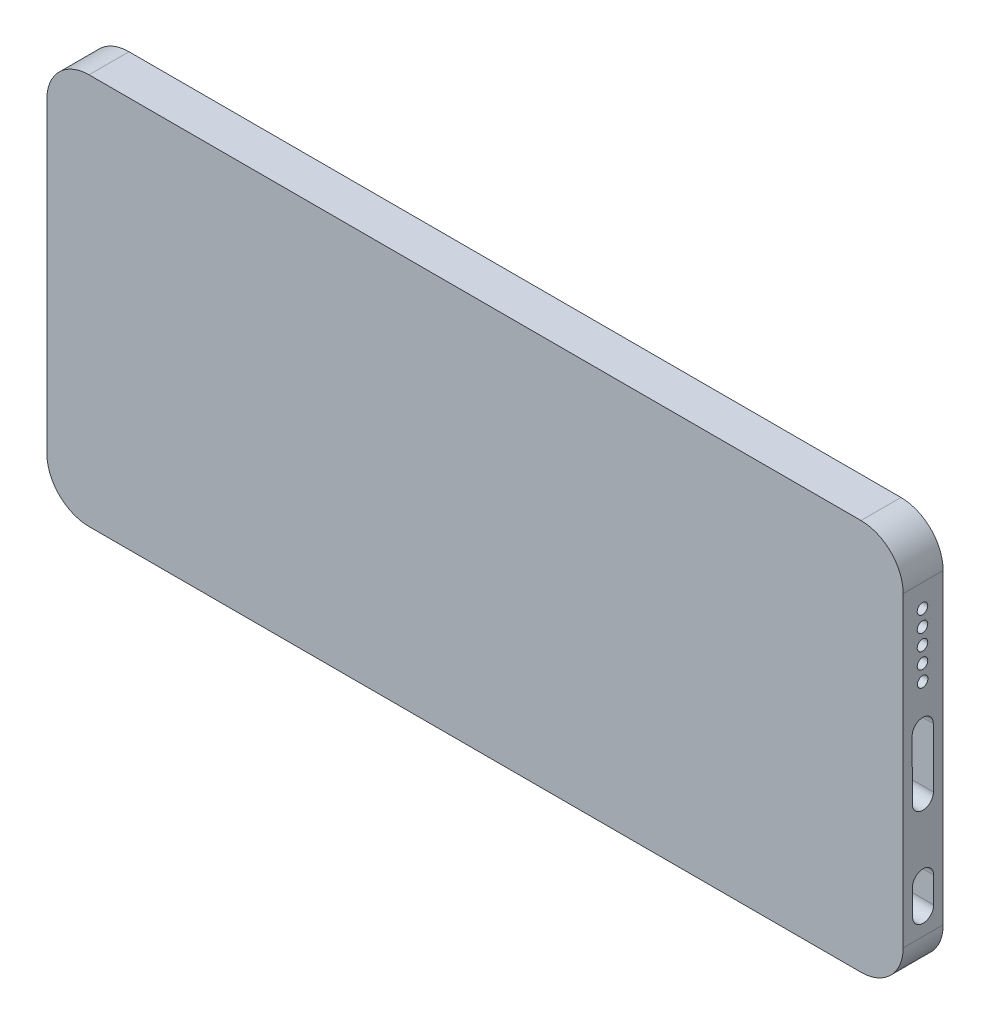
ISO-10303-21;
HEADER;
FILE_DESCRIPTION(('STEP AP214'),'2;1');
FILE_NAME('part.step','',(''),(''),'','','');
FILE_SCHEMA(('AUTOMOTIVE_DESIGN { 1 0 10303 214 1 1 1 1 }'));
ENDSEC;
DATA;
#1=APPLICATION_CONTEXT('core data for automotive mechanical design processes');
#2=APPLICATION_PROTOCOL_DEFINITION('international standard','automotive_design',2000,#1);
#3=PRODUCT_CONTEXT('',#1,'mechanical');
#4=PRODUCT('Part','Part','',(#3));
#5=PRODUCT_RELATED_PRODUCT_CATEGORY('part','',(#4));
#6=PRODUCT_DEFINITION_FORMATION('','',#4);
#7=PRODUCT_DEFINITION_CONTEXT('part definition',#1,'design');
#8=PRODUCT_DEFINITION('design','',#6,#7);
#9=PRODUCT_DEFINITION_SHAPE('','',#8);
#10=(LENGTH_UNIT() NAMED_UNIT(*) SI_UNIT(.MILLI.,.METRE.));
#11=(NAMED_UNIT(*) PLANE_ANGLE_UNIT() SI_UNIT($,.RADIAN.));
#12=(NAMED_UNIT(*) SI_UNIT($,.STERADIAN.) SOLID_ANGLE_UNIT());
#13=UNCERTAINTY_MEASURE_WITH_UNIT(LENGTH_MEASURE(1.E-05),#10,'distance_accuracy_value','');
#14=(GEOMETRIC_REPRESENTATION_CONTEXT(3) GLOBAL_UNCERTAINTY_ASSIGNED_CONTEXT((#13)) GLOBAL_UNIT_ASSIGNED_CONTEXT((#10,
#11,#12)) REPRESENTATION_CONTEXT('',''));
#15=CARTESIAN_POINT('',(0.,0.,0.));
#16=DIRECTION('',(0.,0.,1.));
#17=DIRECTION('',(1.,0.,0.));
#18=AXIS2_PLACEMENT_3D('',#15,#16,#17);
#19=CARTESIAN_POINT('',(-77.3716853932584,35.4058285833908,7.58));
#20=DIRECTION('',(0.,0.,-1.));
#21=DIRECTION('',(-1.,0.,0.));
#22=AXIS2_PLACEMENT_3D('',#19,#20,#21);
#23=CYLINDRICAL_SURFACE('',#22,8.);
#24=CARTESIAN_POINT('',(-77.3716853932584,35.4058285833908,0.));
#25=DIRECTION('',(0.,0.,-1.));
#26=DIRECTION('',(-1.,0.,0.));
#27=AXIS2_PLACEMENT_3D('',#24,#25,#26);
#28=CIRCLE('',#27,8.);
#29=CARTESIAN_POINT('',(-85.3716853932584,35.4058285833907,0.));
#30=VERTEX_POINT('',#29);
#31=CARTESIAN_POINT('',(-77.3716853932584,43.4058285833908,0.));
#32=VERTEX_POINT('',#31);
#33=EDGE_CURVE('E269',#30,#32,#28,.T.);
#34=ORIENTED_EDGE('',*,*,#33,.F.);
#35=DIRECTION('',(0.,0.,-1.));
#36=VECTOR('',#35,1.);
#37=CARTESIAN_POINT('',(-85.3716853932584,35.4058285833907,7.58));
#38=LINE('',#37,#36);
#39=CARTESIAN_POINT('',(-85.3716853932584,35.4058285833907,7.58));
#40=VERTEX_POINT('',#39);
#41=EDGE_CURVE('E11',#40,#30,#38,.T.);
#42=ORIENTED_EDGE('',*,*,#41,.F.);
#43=CARTESIAN_POINT('',(-77.3716853932584,35.4058285833908,7.58));
#44=DIRECTION('',(0.,0.,-1.));
#45=DIRECTION('',(-1.,0.,0.));
#46=AXIS2_PLACEMENT_3D('',#43,#44,#45);
#47=CIRCLE('',#46,8.);
#48=CARTESIAN_POINT('',(-77.3716853932584,43.4058285833908,7.58));
#49=VERTEX_POINT('',#48);
#50=EDGE_CURVE('E278',#40,#49,#47,.T.);
#51=ORIENTED_EDGE('',*,*,#50,.T.);
#52=DIRECTION('',(0.,0.,-1.));
#53=VECTOR('',#52,1.);
#54=CARTESIAN_POINT('',(-77.3716853932584,43.4058285833908,7.58));
#55=LINE('',#54,#53);
#56=EDGE_CURVE('E45',#49,#32,#55,.T.);
#57=ORIENTED_EDGE('',*,*,#56,.T.);
#58=EDGE_LOOP('',(#34,#42,#51,#57));
#59=FACE_BOUND('',#58,.T.);
#60=ADVANCED_FACE('F42',(#59),#23,.T.);
#61=CARTESIAN_POINT('',(-85.3716853932584,35.4058285833907,7.58));
#62=DIRECTION('',(1.,0.,0.));
#63=DIRECTION('',(0.,0.,-1.));
#64=AXIS2_PLACEMENT_3D('',#61,#62,#63);
#65=PLANE('',#64);
#66=DIRECTION('',(0.,-1.,0.));
#67=VECTOR('',#66,1.);
#68=CARTESIAN_POINT('',(-85.3716853932584,35.4058285833907,0.));
#69=LINE('',#68,#67);
#70=CARTESIAN_POINT('',(-85.3716853932584,-22.7941714166092,0.));
#71=VERTEX_POINT('',#70);
#72=EDGE_CURVE('E283',#30,#71,#69,.T.);
#73=ORIENTED_EDGE('',*,*,#72,.T.);
#74=DIRECTION('',(0.,0.,-1.));
#75=VECTOR('',#74,1.);
#76=CARTESIAN_POINT('',(-85.3716853932584,-22.7941714166092,7.58));
#77=LINE('',#76,#75);
#78=CARTESIAN_POINT('',(-85.3716853932584,-22.7941714166092,7.58));
#79=VERTEX_POINT('',#78);
#80=EDGE_CURVE('E51',#79,#71,#77,.T.);
#81=ORIENTED_EDGE('',*,*,#80,.F.);
#82=DIRECTION('',(0.,-1.,0.));
#83=VECTOR('',#82,1.);
#84=CARTESIAN_POINT('',(-85.3716853932584,35.4058285833907,7.58));
#85=LINE('',#84,#83);
#86=EDGE_CURVE('E304',#40,#79,#85,.T.);
#87=ORIENTED_EDGE('',*,*,#86,.F.);
#88=ORIENTED_EDGE('',*,*,#41,.T.);
#89=EDGE_LOOP('',(#73,#81,#87,#88));
#90=FACE_BOUND('',#89,.T.);
#91=ADVANCED_FACE('F369',(#90),#65,.F.);
#92=CARTESIAN_POINT('',(-77.3716853932584,-22.7941714166092,7.58));
#93=DIRECTION('',(0.,0.,-1.));
#94=DIRECTION('',(-1.,0.,0.));
#95=AXIS2_PLACEMENT_3D('',#92,#93,#94);
#96=CYLINDRICAL_SURFACE('',#95,8.);
#97=CARTESIAN_POINT('',(-77.3716853932584,-22.7941714166092,0.));
#98=DIRECTION('',(0.,0.,-1.));
#99=DIRECTION('',(-1.,0.,0.));
#100=AXIS2_PLACEMENT_3D('',#97,#98,#99);
#101=CIRCLE('',#100,8.);
#102=CARTESIAN_POINT('',(-77.3716853932584,-30.7941714166092,0.));
#103=VERTEX_POINT('',#102);
#104=EDGE_CURVE('E329',#103,#71,#101,.T.);
#105=ORIENTED_EDGE('',*,*,#104,.F.);
#106=DIRECTION('',(0.,0.,-1.));
#107=VECTOR('',#106,1.);
#108=CARTESIAN_POINT('',(-77.3716853932584,-30.7941714166092,7.58));
#109=LINE('',#108,#107);
#110=CARTESIAN_POINT('',(-77.3716853932584,-30.7941714166092,7.58));
#111=VERTEX_POINT('',#110);
#112=EDGE_CURVE('E338',#111,#103,#109,.T.);
#113=ORIENTED_EDGE('',*,*,#112,.F.);
#114=CARTESIAN_POINT('',(-77.3716853932584,-22.7941714166092,7.58));
#115=DIRECTION('',(0.,0.,-1.));
#116=DIRECTION('',(-1.,0.,0.));
#117=AXIS2_PLACEMENT_3D('',#114,#115,#116);
#118=CIRCLE('',#117,8.);
#119=EDGE_CURVE('E300',#111,#79,#118,.T.);
#120=ORIENTED_EDGE('',*,*,#119,.T.);
#121=ORIENTED_EDGE('',*,*,#80,.T.);
#122=EDGE_LOOP('',(#105,#113,#120,#121));
#123=FACE_BOUND('',#122,.T.);
#124=ADVANCED_FACE('F388',(#123),#96,.T.);
#125=CARTESIAN_POINT('',(-77.3716853932584,-30.7941714166092,7.58));
#126=DIRECTION('',(0.,1.,0.));
#127=DIRECTION('',(0.,0.,1.));
#128=AXIS2_PLACEMENT_3D('',#125,#126,#127);
#129=PLANE('',#128);
#130=DIRECTION('',(1.,0.,0.));
#131=VECTOR('',#130,1.);
#132=CARTESIAN_POINT('',(-77.3716853932584,-30.7941714166092,0.));
#133=LINE('',#132,#131);
#134=CARTESIAN_POINT('',(69.0283146067415,-30.7941714166092,0.));
#135=VERTEX_POINT('',#134);
#136=EDGE_CURVE('E326',#103,#135,#133,.T.);
#137=ORIENTED_EDGE('',*,*,#136,.T.);
#138=DIRECTION('',(0.,0.,-1.));
#139=VECTOR('',#138,1.);
#140=CARTESIAN_POINT('',(69.0283146067415,-30.7941714166092,7.58));
#141=LINE('',#140,#139);
#142=CARTESIAN_POINT('',(69.0283146067415,-30.7941714166092,7.58));
#143=VERTEX_POINT('',#142);
#144=EDGE_CURVE('E341',#143,#135,#141,.T.);
#145=ORIENTED_EDGE('',*,*,#144,.F.);
#146=DIRECTION('',(1.,0.,0.));
#147=VECTOR('',#146,1.);
#148=CARTESIAN_POINT('',(-77.3716853932584,-30.7941714166092,7.58));
#149=LINE('',#148,#147);
#150=EDGE_CURVE('E297',#111,#143,#149,.T.);
#151=ORIENTED_EDGE('',*,*,#150,.F.);
#152=ORIENTED_EDGE('',*,*,#112,.T.);
#153=EDGE_LOOP('',(#137,#145,#151,#152));
#154=FACE_BOUND('',#153,.T.);
#155=ADVANCED_FACE('F390',(#154),#129,.F.);
#156=CARTESIAN_POINT('',(69.0283146067416,-22.7941714166092,7.58));
#157=DIRECTION('',(0.,0.,-1.));
#158=DIRECTION('',(-1.,0.,0.));
#159=AXIS2_PLACEMENT_3D('',#156,#157,#158);
#160=CYLINDRICAL_SURFACE('',#159,8.);
#161=CARTESIAN_POINT('',(69.0283146067416,-22.7941714166092,0.));
#162=DIRECTION('',(0.,0.,1.));
#163=DIRECTION('',(1.,0.,0.));
#164=AXIS2_PLACEMENT_3D('',#161,#162,#163);
#165=CIRCLE('',#164,8.);
#166=CARTESIAN_POINT('',(77.0283146067416,-22.7941714166092,0.));
#167=VERTEX_POINT('',#166);
#168=EDGE_CURVE('E322',#135,#167,#165,.T.);
#169=ORIENTED_EDGE('',*,*,#168,.T.);
#170=DIRECTION('',(0.,0.,-1.));
#171=VECTOR('',#170,1.);
#172=CARTESIAN_POINT('',(77.0283146067416,-22.7941714166092,7.58));
#173=LINE('',#172,#171);
#174=CARTESIAN_POINT('',(77.0283146067416,-22.7941714166092,7.58));
#175=VERTEX_POINT('',#174);
#176=EDGE_CURVE('E345',#175,#167,#173,.T.);
#177=ORIENTED_EDGE('',*,*,#176,.F.);
#178=CARTESIAN_POINT('',(69.0283146067416,-22.7941714166092,7.58));
#179=DIRECTION('',(0.,0.,1.));
#180=DIRECTION('',(1.,0.,0.));
#181=AXIS2_PLACEMENT_3D('',#178,#179,#180);
#182=CIRCLE('',#181,8.);
#183=EDGE_CURVE('E294',#143,#175,#182,.T.);
#184=ORIENTED_EDGE('',*,*,#183,.F.);
#185=ORIENTED_EDGE('',*,*,#144,.T.);
#186=EDGE_LOOP('',(#169,#177,#184,#185));
#187=FACE_BOUND('',#186,.T.);
#188=ADVANCED_FACE('F384',(#187),#160,.T.);
#189=CARTESIAN_POINT('',(77.0283146067416,35.4058285833907,7.58));
#190=DIRECTION('',(1.,0.,0.));
#191=DIRECTION('',(0.,0.,-1.));
#192=AXIS2_PLACEMENT_3D('',#189,#190,#191);
#193=PLANE('',#192);
#194=CARTESIAN_POINT('',(77.0283146067416,19.0969404425984,3.88823176811583));
#195=DIRECTION('',(1.,0.,0.));
#196=DIRECTION('',(0.,0.,-1.));
#197=AXIS2_PLACEMENT_3D('',#194,#195,#196);
#198=CIRCLE('',#197,0.999999999951786);
#199=CARTESIAN_POINT('',(77.0283146067416,19.0969404425984,2.88823176816404));
#200=VERTEX_POINT('',#199);
#201=EDGE_CURVE('E204',#200,#200,#198,.T.);
#202=ORIENTED_EDGE('',*,*,#201,.F.);
#203=EDGE_LOOP('',(#202));
#204=FACE_BOUND('',#203,.T.);
#205=CARTESIAN_POINT('',(77.0283146067416,22.0969404425984,3.91637094048613));
#206=DIRECTION('',(1.,0.,0.));
#207=DIRECTION('',(0.,0.,-1.));
#208=AXIS2_PLACEMENT_3D('',#205,#206,#207);
#209=CIRCLE('',#208,0.999999999951862);
#210=CARTESIAN_POINT('',(77.0283146067416,22.0969404425984,2.91637094053427));
#211=VERTEX_POINT('',#210);
#212=EDGE_CURVE('E212',#211,#211,#209,.T.);
#213=ORIENTED_EDGE('',*,*,#212,.F.);
#214=EDGE_LOOP('',(#213));
#215=FACE_BOUND('',#214,.T.);
#216=CARTESIAN_POINT('',(77.0283146067416,25.0969404425984,3.91637094048613));
#217=DIRECTION('',(1.,0.,0.));
#218=DIRECTION('',(0.,0.,-1.));
#219=AXIS2_PLACEMENT_3D('',#216,#217,#218);
#220=CIRCLE('',#219,0.999999999951862);
#221=CARTESIAN_POINT('',(77.0283146067416,25.0969404425984,2.91637094053427));
#222=VERTEX_POINT('',#221);
#223=EDGE_CURVE('E220',#222,#222,#220,.T.);
#224=ORIENTED_EDGE('',*,*,#223,.F.);
#225=EDGE_LOOP('',(#224));
#226=FACE_BOUND('',#225,.T.);
#227=CARTESIAN_POINT('',(77.0283146067416,31.0969404425984,3.91637094048613));
#228=DIRECTION('',(1.,0.,0.));
#229=DIRECTION('',(0.,0.,-1.));
#230=AXIS2_PLACEMENT_3D('',#227,#228,#229);
#231=CIRCLE('',#230,0.999999999951861);
#232=CARTESIAN_POINT('',(77.0283146067416,31.0969404425984,2.91637094053427));
#233=VERTEX_POINT('',#232);
#234=EDGE_CURVE('E228',#233,#233,#231,.T.);
#235=ORIENTED_EDGE('',*,*,#234,.F.);
#236=EDGE_LOOP('',(#235));
#237=FACE_BOUND('',#236,.T.);
#238=CARTESIAN_POINT('',(77.0283146067416,28.0969404425984,3.91637094048613));
#239=DIRECTION('',(1.,0.,0.));
#240=DIRECTION('',(0.,0.,-1.));
#241=AXIS2_PLACEMENT_3D('',#238,#239,#240);
#242=CIRCLE('',#241,0.999999999951863);
#243=CARTESIAN_POINT('',(77.0283146067416,28.0969404425984,2.91637094053427));
#244=VERTEX_POINT('',#243);
#245=EDGE_CURVE('E186',#244,#244,#242,.T.);
#246=ORIENTED_EDGE('',*,*,#245,.F.);
#247=EDGE_LOOP('',(#246));
#248=FACE_BOUND('',#247,.T.);
#249=CARTESIAN_POINT('',(77.0283146067416,-18.6281880339233,3.7997689437081));
#250=DIRECTION('',(1.,0.,0.));
#251=DIRECTION('',(0.,0.,-1.));
#252=AXIS2_PLACEMENT_3D('',#249,#250,#251);
#253=CIRCLE('',#252,2.);
#254=CARTESIAN_POINT('',(77.0283146067416,-18.632877883091,5.79976344502924));
#255=VERTEX_POINT('',#254);
#256=CARTESIAN_POINT('',(77.0283146067416,-18.6234981847556,1.79977444238696));
#257=VERTEX_POINT('',#256);
#258=EDGE_CURVE('E59',#255,#257,#253,.T.);
#259=ORIENTED_EDGE('',*,*,#258,.F.);
#260=DIRECTION('',(0.,-0.999997250660569,-0.00234492458384718));
#261=VECTOR('',#260,1.);
#262=CARTESIAN_POINT('',(77.0283146067416,-13.6960273604075,5.81134001901459));
#263=LINE('',#262,#261);
#264=CARTESIAN_POINT('',(77.0283146067416,-13.6960273604075,5.81134001901459));
#265=VERTEX_POINT('',#264);
#266=EDGE_CURVE('E167',#265,#255,#263,.T.);
#267=ORIENTED_EDGE('',*,*,#266,.F.);
#268=CARTESIAN_POINT('',(77.0283146067416,-13.6913375112398,3.81134551769345));
#269=DIRECTION('',(1.,0.,0.));
#270=DIRECTION('',(0.,0.,-1.));
#271=AXIS2_PLACEMENT_3D('',#268,#269,#270);
#272=CIRCLE('',#271,2.);
#273=CARTESIAN_POINT('',(77.0283146067416,-13.6866476620721,1.81135101637231));
#274=VERTEX_POINT('',#273);
#275=EDGE_CURVE('E173',#274,#265,#272,.T.);
#276=ORIENTED_EDGE('',*,*,#275,.F.);
#277=DIRECTION('',(0.,-0.999997250660569,-0.00234492458384735));
#278=VECTOR('',#277,1.);
#279=CARTESIAN_POINT('',(77.0283146067416,-13.6866476620721,1.81135101637231));
#280=LINE('',#279,#278);
#281=EDGE_CURVE('E179',#274,#257,#280,.T.);
#282=ORIENTED_EDGE('',*,*,#281,.T.);
#283=EDGE_LOOP('',(#259,#267,#276,#282));
#284=FACE_BOUND('',#283,.T.);
#285=CARTESIAN_POINT('',(77.0283146067416,11.1973837203838,3.86970785242788));
#286=DIRECTION('',(1.,0.,0.));
#287=DIRECTION('',(0.,0.,-1.));
#288=AXIS2_PLACEMENT_3D('',#285,#286,#287);
#289=CIRCLE('',#288,2.);
#290=CARTESIAN_POINT('',(77.0283146067416,11.2020735695515,1.86971335110674));
#291=VERTEX_POINT('',#290);
#292=CARTESIAN_POINT('',(77.0283146067416,11.1926938712161,5.86970235374901));
#293=VERTEX_POINT('',#292);
#294=EDGE_CURVE('E67',#291,#293,#289,.T.);
#295=ORIENTED_EDGE('',*,*,#294,.F.);
#296=DIRECTION('',(0.,-0.999997250660569,-0.0023449245838473));
#297=VECTOR('',#296,1.);
#298=CARTESIAN_POINT('',(77.0283146067416,11.2020735695515,1.86971335110674));
#299=LINE('',#298,#297);
#300=CARTESIAN_POINT('',(77.0283146067416,-0.0475674192467971,1.84333371886609));
#301=VERTEX_POINT('',#300);
#302=EDGE_CURVE('E241',#291,#301,#299,.T.);
#303=ORIENTED_EDGE('',*,*,#302,.T.);
#304=CARTESIAN_POINT('',(77.0283146067416,-0.052257268414492,3.84332822018723));
#305=DIRECTION('',(1.,0.,0.));
#306=DIRECTION('',(0.,0.,-1.));
#307=AXIS2_PLACEMENT_3D('',#304,#305,#306);
#308=CIRCLE('',#307,2.);
#309=CARTESIAN_POINT('',(77.0283146067416,-0.0569471175821866,5.84332272150836));
#310=VERTEX_POINT('',#309);
#311=EDGE_CURVE('E259',#310,#301,#308,.T.);
#312=ORIENTED_EDGE('',*,*,#311,.F.);
#313=DIRECTION('',(0.,-0.999997250660569,-0.00234492458384727));
#314=VECTOR('',#313,1.);
#315=CARTESIAN_POINT('',(77.0283146067416,11.1926938712161,5.86970235374902));
#316=LINE('',#315,#314);
#317=EDGE_CURVE('E255',#293,#310,#316,.T.);
#318=ORIENTED_EDGE('',*,*,#317,.F.);
#319=EDGE_LOOP('',(#295,#303,#312,#318));
#320=FACE_BOUND('',#319,.T.);
#321=DIRECTION('',(0.,-1.,0.));
#322=VECTOR('',#321,1.);
#323=CARTESIAN_POINT('',(77.0283146067416,35.4058285833907,0.));
#324=LINE('',#323,#322);
#325=CARTESIAN_POINT('',(77.0283146067416,35.4058285833907,0.));
#326=VERTEX_POINT('',#325);
#327=EDGE_CURVE('E318',#326,#167,#324,.T.);
#328=ORIENTED_EDGE('',*,*,#327,.F.);
#329=DIRECTION('',(0.,0.,-1.));
#330=VECTOR('',#329,1.);
#331=CARTESIAN_POINT('',(77.0283146067416,35.4058285833907,7.58));
#332=LINE('',#331,#330);
#333=CARTESIAN_POINT('',(77.0283146067416,35.4058285833907,7.58));
#334=VERTEX_POINT('',#333);
#335=EDGE_CURVE('E348',#334,#326,#332,.T.);
#336=ORIENTED_EDGE('',*,*,#335,.F.);
#337=DIRECTION('',(0.,-1.,0.));
#338=VECTOR('',#337,1.);
#339=CARTESIAN_POINT('',(77.0283146067416,35.4058285833907,7.58));
#340=LINE('',#339,#338);
#341=EDGE_CURVE('E290',#334,#175,#340,.T.);
#342=ORIENTED_EDGE('',*,*,#341,.T.);
#343=ORIENTED_EDGE('',*,*,#176,.T.);
#344=EDGE_LOOP('',(#328,#336,#342,#343));
#345=FACE_BOUND('',#344,.T.);
#346=ADVANCED_FACE('F176',(#204,#215,#226,#237,#248,#284,#320,#345),#193,.T.);
#347=CARTESIAN_POINT('',(69.0283146067416,35.4058285833908,7.58));
#348=DIRECTION('',(0.,0.,-1.));
#349=DIRECTION('',(-1.,0.,0.));
#350=AXIS2_PLACEMENT_3D('',#347,#348,#349);
#351=CYLINDRICAL_SURFACE('',#350,8.);
#352=CARTESIAN_POINT('',(69.0283146067416,35.4058285833908,0.));
#353=DIRECTION('',(0.,0.,1.));
#354=DIRECTION('',(1.,0.,0.));
#355=AXIS2_PLACEMENT_3D('',#352,#353,#354);
#356=CIRCLE('',#355,8.);
#357=CARTESIAN_POINT('',(69.0283146067415,43.4058285833908,0.));
#358=VERTEX_POINT('',#357);
#359=EDGE_CURVE('E314',#326,#358,#356,.T.);
#360=ORIENTED_EDGE('',*,*,#359,.T.);
#361=DIRECTION('',(0.,0.,-1.));
#362=VECTOR('',#361,1.);
#363=CARTESIAN_POINT('',(69.0283146067415,43.4058285833908,7.58));
#364=LINE('',#363,#362);
#365=CARTESIAN_POINT('',(69.0283146067415,43.4058285833908,7.58));
#366=VERTEX_POINT('',#365);
#367=EDGE_CURVE('E350',#366,#358,#364,.T.);
#368=ORIENTED_EDGE('',*,*,#367,.F.);
#369=CARTESIAN_POINT('',(69.0283146067416,35.4058285833908,7.58));
#370=DIRECTION('',(0.,0.,1.));
#371=DIRECTION('',(1.,0.,0.));
#372=AXIS2_PLACEMENT_3D('',#369,#370,#371);
#373=CIRCLE('',#372,8.);
#374=EDGE_CURVE('E287',#334,#366,#373,.T.);
#375=ORIENTED_EDGE('',*,*,#374,.F.);
#376=ORIENTED_EDGE('',*,*,#335,.T.);
#377=EDGE_LOOP('',(#360,#368,#375,#376));
#378=FACE_BOUND('',#377,.T.);
#379=ADVANCED_FACE('F377',(#378),#351,.T.);
#380=CARTESIAN_POINT('',(-77.3716853932584,43.4058285833908,7.58));
#381=DIRECTION('',(0.,1.,0.));
#382=DIRECTION('',(0.,0.,1.));
#383=AXIS2_PLACEMENT_3D('',#380,#381,#382);
#384=PLANE('',#383);
#385=DIRECTION('',(1.,0.,0.));
#386=VECTOR('',#385,1.);
#387=CARTESIAN_POINT('',(-77.3716853932584,43.4058285833908,0.));
#388=LINE('',#387,#386);
#389=EDGE_CURVE('E310',#32,#358,#388,.T.);
#390=ORIENTED_EDGE('',*,*,#389,.F.);
#391=ORIENTED_EDGE('',*,*,#56,.F.);
#392=DIRECTION('',(1.,0.,0.));
#393=VECTOR('',#392,1.);
#394=CARTESIAN_POINT('',(-77.3716853932584,43.4058285833908,7.58));
#395=LINE('',#394,#393);
#396=EDGE_CURVE('E282',#49,#366,#395,.T.);
#397=ORIENTED_EDGE('',*,*,#396,.T.);
#398=ORIENTED_EDGE('',*,*,#367,.T.);
#399=EDGE_LOOP('',(#390,#391,#397,#398));
#400=FACE_BOUND('',#399,.T.);
#401=ADVANCED_FACE('F360',(#400),#384,.T.);
#402=CARTESIAN_POINT('',(-77.3716853932584,35.4058285833908,7.58));
#403=DIRECTION('',(0.,0.,-1.));
#404=DIRECTION('',(-1.,0.,0.));
#405=AXIS2_PLACEMENT_3D('',#402,#403,#404);
#406=PLANE('',#405);
#407=ORIENTED_EDGE('',*,*,#50,.F.);
#408=ORIENTED_EDGE('',*,*,#86,.T.);
#409=ORIENTED_EDGE('',*,*,#119,.F.);
#410=ORIENTED_EDGE('',*,*,#150,.T.);
#411=ORIENTED_EDGE('',*,*,#183,.T.);
#412=ORIENTED_EDGE('',*,*,#341,.F.);
#413=ORIENTED_EDGE('',*,*,#374,.T.);
#414=ORIENTED_EDGE('',*,*,#396,.F.);
#415=EDGE_LOOP('',(#407,#408,#409,#410,#411,#412,#413,#414));
#416=FACE_BOUND('',#415,.T.);
#417=ADVANCED_FACE('F373',(#416),#406,.F.);
#418=CARTESIAN_POINT('',(-77.3716853932584,35.4058285833908,0.));
#419=DIRECTION('',(0.,0.,-1.));
#420=DIRECTION('',(-1.,0.,0.));
#421=AXIS2_PLACEMENT_3D('',#418,#419,#420);
#422=PLANE('',#421);
#423=ORIENTED_EDGE('',*,*,#33,.T.);
#424=ORIENTED_EDGE('',*,*,#389,.T.);
#425=ORIENTED_EDGE('',*,*,#359,.F.);
#426=ORIENTED_EDGE('',*,*,#327,.T.);
#427=ORIENTED_EDGE('',*,*,#168,.F.);
#428=ORIENTED_EDGE('',*,*,#136,.F.);
#429=ORIENTED_EDGE('',*,*,#104,.T.);
#430=ORIENTED_EDGE('',*,*,#72,.F.);
#431=EDGE_LOOP('',(#423,#424,#425,#426,#427,#428,#429,#430));
#432=FACE_BOUND('',#431,.T.);
#433=ADVANCED_FACE('F364',(#432),#422,.T.);
#434=CARTESIAN_POINT('',(67.0283146067416,11.1973837203838,3.86970785242788));
#435=DIRECTION('',(1.,0.,0.));
#436=DIRECTION('',(0.,0.,-1.));
#437=AXIS2_PLACEMENT_3D('',#434,#435,#436);
#438=CYLINDRICAL_SURFACE('',#437,2.);
#439=ORIENTED_EDGE('',*,*,#294,.T.);
#440=DIRECTION('',(1.,0.,0.));
#441=VECTOR('',#440,1.);
#442=CARTESIAN_POINT('',(67.0283146067416,11.1926938712161,5.86970235374902));
#443=LINE('',#442,#441);
#444=CARTESIAN_POINT('',(67.0283146067416,11.1926938712161,5.86970235374902));
#445=VERTEX_POINT('',#444);
#446=EDGE_CURVE('E252',#445,#293,#443,.T.);
#447=ORIENTED_EDGE('',*,*,#446,.F.);
#448=CARTESIAN_POINT('',(67.0283146067416,11.1973837203838,3.86970785242788));
#449=DIRECTION('',(1.,0.,0.));
#450=DIRECTION('',(0.,0.,-1.));
#451=AXIS2_PLACEMENT_3D('',#448,#449,#450);
#452=CIRCLE('',#451,2.);
#453=CARTESIAN_POINT('',(67.0283146067416,11.2020735695515,1.86971335110674));
#454=VERTEX_POINT('',#453);
#455=EDGE_CURVE('E236',#454,#445,#452,.T.);
#456=ORIENTED_EDGE('',*,*,#455,.F.);
#457=DIRECTION('',(1.,0.,0.));
#458=VECTOR('',#457,1.);
#459=CARTESIAN_POINT('',(67.0283146067416,11.2020735695515,1.86971335110674));
#460=LINE('',#459,#458);
#461=EDGE_CURVE('E266',#454,#291,#460,.T.);
#462=ORIENTED_EDGE('',*,*,#461,.T.);
#463=EDGE_LOOP('',(#439,#447,#456,#462));
#464=FACE_BOUND('',#463,.T.);
#465=ADVANCED_FACE('F409',(#464),#438,.F.);
#466=CARTESIAN_POINT('',(67.0283146067416,11.2020735695515,1.86971335110674));
#467=DIRECTION('',(0.,-0.0023449245838473,0.999997250660569));
#468=DIRECTION('',(0.,-0.999997250660569,-0.0023449245838473));
#469=AXIS2_PLACEMENT_3D('',#466,#467,#468);
#470=PLANE('',#469);
#471=ORIENTED_EDGE('',*,*,#302,.F.);
#472=ORIENTED_EDGE('',*,*,#461,.F.);
#473=DIRECTION('',(0.,-0.999997250660569,-0.0023449245838473));
#474=VECTOR('',#473,1.);
#475=CARTESIAN_POINT('',(67.0283146067416,11.2020735695515,1.86971335110674));
#476=LINE('',#475,#474);
#477=CARTESIAN_POINT('',(67.0283146067416,-0.0475674192467971,1.84333371886609));
#478=VERTEX_POINT('',#477);
#479=EDGE_CURVE('E249',#454,#478,#476,.T.);
#480=ORIENTED_EDGE('',*,*,#479,.T.);
#481=DIRECTION('',(1.,0.,0.));
#482=VECTOR('',#481,1.);
#483=CARTESIAN_POINT('',(67.0283146067416,-0.0475674192467971,1.84333371886609));
#484=LINE('',#483,#482);
#485=EDGE_CURVE('E270',#478,#301,#484,.T.);
#486=ORIENTED_EDGE('',*,*,#485,.T.);
#487=EDGE_LOOP('',(#471,#472,#480,#486));
#488=FACE_BOUND('',#487,.T.);
#489=ADVANCED_FACE('F414',(#488),#470,.T.);
#490=CARTESIAN_POINT('',(67.0283146067416,-0.052257268414492,3.84332822018723));
#491=DIRECTION('',(1.,0.,0.));
#492=DIRECTION('',(0.,0.,-1.));
#493=AXIS2_PLACEMENT_3D('',#490,#491,#492);
#494=CYLINDRICAL_SURFACE('',#493,2.);
#495=ORIENTED_EDGE('',*,*,#311,.T.);
#496=ORIENTED_EDGE('',*,*,#485,.F.);
#497=CARTESIAN_POINT('',(67.0283146067416,-0.052257268414492,3.84332822018723));
#498=DIRECTION('',(1.,0.,0.));
#499=DIRECTION('',(0.,0.,-1.));
#500=AXIS2_PLACEMENT_3D('',#497,#498,#499);
#501=CIRCLE('',#500,2.);
#502=CARTESIAN_POINT('',(67.0283146067416,-0.0569471175821866,5.84332272150836));
#503=VERTEX_POINT('',#502);
#504=EDGE_CURVE('E245',#503,#478,#501,.T.);
#505=ORIENTED_EDGE('',*,*,#504,.F.);
#506=DIRECTION('',(1.,0.,0.));
#507=VECTOR('',#506,1.);
#508=CARTESIAN_POINT('',(67.0283146067416,-0.0569471175821866,5.84332272150836));
#509=LINE('',#508,#507);
#510=EDGE_CURVE('E273',#503,#310,#509,.T.);
#511=ORIENTED_EDGE('',*,*,#510,.T.);
#512=EDGE_LOOP('',(#495,#496,#505,#511));
#513=FACE_BOUND('',#512,.T.);
#514=ADVANCED_FACE('F419',(#513),#494,.F.);
#515=CARTESIAN_POINT('',(67.0283146067416,11.1926938712161,5.86970235374902));
#516=DIRECTION('',(0.,-0.00234492458384727,0.999997250660569));
#517=DIRECTION('',(0.,-0.999997250660569,-0.00234492458384727));
#518=AXIS2_PLACEMENT_3D('',#515,#516,#517);
#519=PLANE('',#518);
#520=ORIENTED_EDGE('',*,*,#317,.T.);
#521=ORIENTED_EDGE('',*,*,#510,.F.);
#522=DIRECTION('',(0.,-0.999997250660569,-0.00234492458384727));
#523=VECTOR('',#522,1.);
#524=CARTESIAN_POINT('',(67.0283146067416,11.1926938712161,5.86970235374902));
#525=LINE('',#524,#523);
#526=EDGE_CURVE('E240',#445,#503,#525,.T.);
#527=ORIENTED_EDGE('',*,*,#526,.F.);
#528=ORIENTED_EDGE('',*,*,#446,.T.);
#529=EDGE_LOOP('',(#520,#521,#527,#528));
#530=FACE_BOUND('',#529,.T.);
#531=ADVANCED_FACE('F415',(#530),#519,.F.);
#532=CARTESIAN_POINT('',(67.0283146067416,11.1973837203838,3.86970785242788));
#533=DIRECTION('',(1.,0.,0.));
#534=DIRECTION('',(0.,0.,-1.));
#535=AXIS2_PLACEMENT_3D('',#532,#533,#534);
#536=PLANE('',#535);
#537=ORIENTED_EDGE('',*,*,#455,.T.);
#538=ORIENTED_EDGE('',*,*,#526,.T.);
#539=ORIENTED_EDGE('',*,*,#504,.T.);
#540=ORIENTED_EDGE('',*,*,#479,.F.);
#541=EDGE_LOOP('',(#537,#538,#539,#540));
#542=FACE_BOUND('',#541,.T.);
#543=ADVANCED_FACE('F418',(#542),#536,.T.);
#544=CARTESIAN_POINT('',(67.0283146067416,-18.6281880339233,3.7997689437081));
#545=DIRECTION('',(1.,0.,0.));
#546=DIRECTION('',(0.,0.,-1.));
#547=AXIS2_PLACEMENT_3D('',#544,#545,#546);
#548=CYLINDRICAL_SURFACE('',#547,2.);
#549=ORIENTED_EDGE('',*,*,#258,.T.);
#550=DIRECTION('',(1.,0.,0.));
#551=VECTOR('',#550,1.);
#552=CARTESIAN_POINT('',(67.0283146067416,-18.6234981847556,1.79977444238696));
#553=LINE('',#552,#551);
#554=CARTESIAN_POINT('',(67.0283146067416,-18.6234981847556,1.79977444238696));
#555=VERTEX_POINT('',#554);
#556=EDGE_CURVE('E195',#555,#257,#553,.T.);
#557=ORIENTED_EDGE('',*,*,#556,.F.);
#558=CARTESIAN_POINT('',(67.0283146067416,-18.6281880339233,3.7997689437081));
#559=DIRECTION('',(1.,0.,0.));
#560=DIRECTION('',(0.,0.,-1.));
#561=AXIS2_PLACEMENT_3D('',#558,#559,#560);
#562=CIRCLE('',#561,2.);
#563=CARTESIAN_POINT('',(67.0283146067416,-18.632877883091,5.79976344502924));
#564=VERTEX_POINT('',#563);
#565=EDGE_CURVE('E159',#564,#555,#562,.T.);
#566=ORIENTED_EDGE('',*,*,#565,.F.);
#567=DIRECTION('',(1.,0.,0.));
#568=VECTOR('',#567,1.);
#569=CARTESIAN_POINT('',(67.0283146067416,-18.632877883091,5.79976344502924));
#570=LINE('',#569,#568);
#571=EDGE_CURVE('E155',#564,#255,#570,.T.);
#572=ORIENTED_EDGE('',*,*,#571,.T.);
#573=EDGE_LOOP('',(#549,#557,#566,#572));
#574=FACE_BOUND('',#573,.T.);
#575=ADVANCED_FACE('F157',(#574),#548,.F.);
#576=CARTESIAN_POINT('',(67.0283146067416,-13.6960273604075,5.81134001901459));
#577=DIRECTION('',(0.,-0.00234492458384718,0.999997250660569));
#578=DIRECTION('',(0.,-0.999997250660569,-0.00234492458384718));
#579=AXIS2_PLACEMENT_3D('',#576,#577,#578);
#580=PLANE('',#579);
#581=ORIENTED_EDGE('',*,*,#266,.T.);
#582=ORIENTED_EDGE('',*,*,#571,.F.);
#583=DIRECTION('',(0.,-0.999997250660569,-0.00234492458384718));
#584=VECTOR('',#583,1.);
#585=CARTESIAN_POINT('',(67.0283146067416,-13.6960273604075,5.81134001901459));
#586=LINE('',#585,#584);
#587=CARTESIAN_POINT('',(67.0283146067416,-13.6960273604075,5.81134001901459));
#588=VERTEX_POINT('',#587);
#589=EDGE_CURVE('E191',#588,#564,#586,.T.);
#590=ORIENTED_EDGE('',*,*,#589,.F.);
#591=DIRECTION('',(1.,0.,0.));
#592=VECTOR('',#591,1.);
#593=CARTESIAN_POINT('',(67.0283146067416,-13.6960273604075,5.81134001901459));
#594=LINE('',#593,#592);
#595=EDGE_CURVE('E164',#588,#265,#594,.T.);
#596=ORIENTED_EDGE('',*,*,#595,.T.);
#597=EDGE_LOOP('',(#581,#582,#590,#596));
#598=FACE_BOUND('',#597,.T.);
#599=ADVANCED_FACE('F168',(#598),#580,.F.);
#600=CARTESIAN_POINT('',(67.0283146067416,-13.6913375112398,3.81134551769345));
#601=DIRECTION('',(1.,0.,0.));
#602=DIRECTION('',(0.,0.,-1.));
#603=AXIS2_PLACEMENT_3D('',#600,#601,#602);
#604=CYLINDRICAL_SURFACE('',#603,2.);
#605=ORIENTED_EDGE('',*,*,#275,.T.);
#606=ORIENTED_EDGE('',*,*,#595,.F.);
#607=CARTESIAN_POINT('',(67.0283146067416,-13.6913375112398,3.81134551769345));
#608=DIRECTION('',(1.,0.,0.));
#609=DIRECTION('',(0.,0.,-1.));
#610=AXIS2_PLACEMENT_3D('',#607,#608,#609);
#611=CIRCLE('',#610,2.);
#612=CARTESIAN_POINT('',(67.0283146067416,-13.6866476620721,1.81135101637231));
#613=VERTEX_POINT('',#612);
#614=EDGE_CURVE('E194',#613,#588,#611,.T.);
#615=ORIENTED_EDGE('',*,*,#614,.F.);
#616=DIRECTION('',(1.,0.,0.));
#617=VECTOR('',#616,1.);
#618=CARTESIAN_POINT('',(67.0283146067416,-13.6866476620721,1.81135101637231));
#619=LINE('',#618,#617);
#620=EDGE_CURVE('E497',#613,#274,#619,.T.);
#621=ORIENTED_EDGE('',*,*,#620,.T.);
#622=EDGE_LOOP('',(#605,#606,#615,#621));
#623=FACE_BOUND('',#622,.T.);
#624=ADVANCED_FACE('F471',(#623),#604,.F.);
#625=CARTESIAN_POINT('',(67.0283146067416,-13.6866476620721,1.81135101637231));
#626=DIRECTION('',(0.,-0.00234492458384735,0.999997250660569));
#627=DIRECTION('',(0.,-0.999997250660569,-0.00234492458384735));
#628=AXIS2_PLACEMENT_3D('',#625,#626,#627);
#629=PLANE('',#628);
#630=ORIENTED_EDGE('',*,*,#281,.F.);
#631=ORIENTED_EDGE('',*,*,#620,.F.);
#632=DIRECTION('',(0.,-0.999997250660569,-0.00234492458384735));
#633=VECTOR('',#632,1.);
#634=CARTESIAN_POINT('',(67.0283146067416,-13.6866476620721,1.81135101637231));
#635=LINE('',#634,#633);
#636=EDGE_CURVE('E199',#613,#555,#635,.T.);
#637=ORIENTED_EDGE('',*,*,#636,.T.);
#638=ORIENTED_EDGE('',*,*,#556,.T.);
#639=EDGE_LOOP('',(#630,#631,#637,#638));
#640=FACE_BOUND('',#639,.T.);
#641=ADVANCED_FACE('F467',(#640),#629,.T.);
#642=CARTESIAN_POINT('',(67.0283146067416,-18.6281880339233,3.7997689437081));
#643=DIRECTION('',(1.,0.,0.));
#644=DIRECTION('',(0.,0.,-1.));
#645=AXIS2_PLACEMENT_3D('',#642,#643,#644);
#646=PLANE('',#645);
#647=ORIENTED_EDGE('',*,*,#565,.T.);
#648=ORIENTED_EDGE('',*,*,#636,.F.);
#649=ORIENTED_EDGE('',*,*,#614,.T.);
#650=ORIENTED_EDGE('',*,*,#589,.T.);
#651=EDGE_LOOP('',(#647,#648,#649,#650));
#652=FACE_BOUND('',#651,.T.);
#653=ADVANCED_FACE('F463',(#652),#646,.T.);
#654=CARTESIAN_POINT('',(67.0283146067416,28.0969404425984,3.91637094048613));
#655=DIRECTION('',(1.,0.,0.));
#656=DIRECTION('',(0.,0.,-1.));
#657=AXIS2_PLACEMENT_3D('',#654,#655,#656);
#658=CYLINDRICAL_SURFACE('',#657,0.999999999951863);
#659=CARTESIAN_POINT('',(67.0283146067416,28.0969404425984,3.91637094048613));
#660=DIRECTION('',(1.,0.,0.));
#661=DIRECTION('',(0.,0.,-1.));
#662=AXIS2_PLACEMENT_3D('',#659,#660,#661);
#663=CIRCLE('',#662,0.999999999951863);
#664=CARTESIAN_POINT('',(67.0283146067416,28.0969404425984,2.91637094053427));
#665=VERTEX_POINT('',#664);
#666=EDGE_CURVE('E181',#665,#665,#663,.T.);
#667=ORIENTED_EDGE('',*,*,#666,.F.);
#668=EDGE_LOOP('',(#667));
#669=FACE_BOUND('',#668,.T.);
#670=ORIENTED_EDGE('',*,*,#245,.T.);
#671=EDGE_LOOP('',(#670));
#672=FACE_BOUND('',#671,.T.);
#673=ADVANCED_FACE('F466',(#669,#672),#658,.F.);
#674=CARTESIAN_POINT('',(67.0283146067416,28.0969404425984,3.91637094048613));
#675=DIRECTION('',(1.,0.,0.));
#676=DIRECTION('',(0.,0.,-1.));
#677=AXIS2_PLACEMENT_3D('',#674,#675,#676);
#678=PLANE('',#677);
#679=ORIENTED_EDGE('',*,*,#666,.T.);
#680=EDGE_LOOP('',(#679));
#681=FACE_BOUND('',#680,.T.);
#682=ADVANCED_FACE('F438',(#681),#678,.T.);
#683=CARTESIAN_POINT('',(67.0283146067416,31.0969404425984,3.91637094048613));
#684=DIRECTION('',(1.,0.,0.));
#685=DIRECTION('',(0.,0.,-1.));
#686=AXIS2_PLACEMENT_3D('',#683,#684,#685);
#687=CYLINDRICAL_SURFACE('',#686,0.999999999951861);
#688=CARTESIAN_POINT('',(67.0283146067416,31.0969404425984,3.91637094048613));
#689=DIRECTION('',(1.,0.,0.));
#690=DIRECTION('',(0.,0.,-1.));
#691=AXIS2_PLACEMENT_3D('',#688,#689,#690);
#692=CIRCLE('',#691,0.999999999951861);
#693=CARTESIAN_POINT('',(67.0283146067416,31.0969404425984,2.91637094053427));
#694=VERTEX_POINT('',#693);
#695=EDGE_CURVE('E232',#694,#694,#692,.T.);
#696=ORIENTED_EDGE('',*,*,#695,.F.);
#697=EDGE_LOOP('',(#696));
#698=FACE_BOUND('',#697,.T.);
#699=ORIENTED_EDGE('',*,*,#234,.T.);
#700=EDGE_LOOP('',(#699));
#701=FACE_BOUND('',#700,.T.);
#702=ADVANCED_FACE('F434',(#698,#701),#687,.F.);
#703=CARTESIAN_POINT('',(67.0283146067416,31.0969404425984,3.91637094048613));
#704=DIRECTION('',(1.,0.,0.));
#705=DIRECTION('',(0.,0.,-1.));
#706=AXIS2_PLACEMENT_3D('',#703,#704,#705);
#707=PLANE('',#706);
#708=ORIENTED_EDGE('',*,*,#695,.T.);
#709=EDGE_LOOP('',(#708));
#710=FACE_BOUND('',#709,.T.);
#711=ADVANCED_FACE('F430',(#710),#707,.T.);
#712=CARTESIAN_POINT('',(67.0283146067416,25.0969404425984,3.91637094048613));
#713=DIRECTION('',(1.,0.,0.));
#714=DIRECTION('',(0.,0.,-1.));
#715=AXIS2_PLACEMENT_3D('',#712,#713,#714);
#716=CYLINDRICAL_SURFACE('',#715,0.999999999951862);
#717=CARTESIAN_POINT('',(67.0283146067416,25.0969404425984,3.91637094048613));
#718=DIRECTION('',(1.,0.,0.));
#719=DIRECTION('',(0.,0.,-1.));
#720=AXIS2_PLACEMENT_3D('',#717,#718,#719);
#721=CIRCLE('',#720,0.999999999951862);
#722=CARTESIAN_POINT('',(67.0283146067416,25.0969404425984,2.91637094053427));
#723=VERTEX_POINT('',#722);
#724=EDGE_CURVE('E224',#723,#723,#721,.T.);
#725=ORIENTED_EDGE('',*,*,#724,.F.);
#726=EDGE_LOOP('',(#725));
#727=FACE_BOUND('',#726,.T.);
#728=ORIENTED_EDGE('',*,*,#223,.T.);
#729=EDGE_LOOP('',(#728));
#730=FACE_BOUND('',#729,.T.);
#731=ADVANCED_FACE('F433',(#727,#730),#716,.F.);
#732=CARTESIAN_POINT('',(67.0283146067416,25.0969404425984,3.91637094048613));
#733=DIRECTION('',(1.,0.,0.));
#734=DIRECTION('',(0.,0.,-1.));
#735=AXIS2_PLACEMENT_3D('',#732,#733,#734);
#736=PLANE('',#735);
#737=ORIENTED_EDGE('',*,*,#724,.T.);
#738=EDGE_LOOP('',(#737));
#739=FACE_BOUND('',#738,.T.);
#740=ADVANCED_FACE('F440',(#739),#736,.T.);
#741=CARTESIAN_POINT('',(67.0283146067416,22.0969404425984,3.91637094048613));
#742=DIRECTION('',(1.,0.,0.));
#743=DIRECTION('',(0.,0.,-1.));
#744=AXIS2_PLACEMENT_3D('',#741,#742,#743);
#745=CYLINDRICAL_SURFACE('',#744,0.999999999951862);
#746=CARTESIAN_POINT('',(67.0283146067416,22.0969404425984,3.91637094048613));
#747=DIRECTION('',(1.,0.,0.));
#748=DIRECTION('',(0.,0.,-1.));
#749=AXIS2_PLACEMENT_3D('',#746,#747,#748);
#750=CIRCLE('',#749,0.999999999951862);
#751=CARTESIAN_POINT('',(67.0283146067416,22.0969404425984,2.91637094053427));
#752=VERTEX_POINT('',#751);
#753=EDGE_CURVE('E216',#752,#752,#750,.T.);
#754=ORIENTED_EDGE('',*,*,#753,.F.);
#755=EDGE_LOOP('',(#754));
#756=FACE_BOUND('',#755,.T.);
#757=ORIENTED_EDGE('',*,*,#212,.T.);
#758=EDGE_LOOP('',(#757));
#759=FACE_BOUND('',#758,.T.);
#760=ADVANCED_FACE('F443',(#756,#759),#745,.F.);
#761=CARTESIAN_POINT('',(67.0283146067416,22.0969404425984,3.91637094048613));
#762=DIRECTION('',(1.,0.,0.));
#763=DIRECTION('',(0.,0.,-1.));
#764=AXIS2_PLACEMENT_3D('',#761,#762,#763);
#765=PLANE('',#764);
#766=ORIENTED_EDGE('',*,*,#753,.T.);
#767=EDGE_LOOP('',(#766));
#768=FACE_BOUND('',#767,.T.);
#769=ADVANCED_FACE('F448',(#768),#765,.T.);
#770=CARTESIAN_POINT('',(67.0283146067416,19.0969404425984,3.88823176811583));
#771=DIRECTION('',(1.,0.,0.));
#772=DIRECTION('',(0.,0.,-1.));
#773=AXIS2_PLACEMENT_3D('',#770,#771,#772);
#774=CYLINDRICAL_SURFACE('',#773,0.999999999951786);
#775=CARTESIAN_POINT('',(67.0283146067416,19.0969404425984,3.88823176811583));
#776=DIRECTION('',(1.,0.,0.));
#777=DIRECTION('',(0.,0.,-1.));
#778=AXIS2_PLACEMENT_3D('',#775,#776,#777);
#779=CIRCLE('',#778,0.999999999951786);
#780=CARTESIAN_POINT('',(67.0283146067416,19.0969404425984,2.88823176816404));
#781=VERTEX_POINT('',#780);
#782=EDGE_CURVE('E208',#781,#781,#779,.T.);
#783=ORIENTED_EDGE('',*,*,#782,.F.);
#784=EDGE_LOOP('',(#783));
#785=FACE_BOUND('',#784,.T.);
#786=ORIENTED_EDGE('',*,*,#201,.T.);
#787=EDGE_LOOP('',(#786));
#788=FACE_BOUND('',#787,.T.);
#789=ADVANCED_FACE('F451',(#785,#788),#774,.F.);
#790=CARTESIAN_POINT('',(67.0283146067416,19.0969404425984,3.88823176811583));
#791=DIRECTION('',(1.,0.,0.));
#792=DIRECTION('',(0.,0.,-1.));
#793=AXIS2_PLACEMENT_3D('',#790,#791,#792);
#794=PLANE('',#793);
#795=ORIENTED_EDGE('',*,*,#782,.T.);
#796=EDGE_LOOP('',(#795));
#797=FACE_BOUND('',#796,.T.);
#798=ADVANCED_FACE('F456',(#797),#794,.T.);
#799=CLOSED_SHELL('',(#60,#91,#124,#155,#188,#346,#379,#401,#417,#433,#465,#489,#514,#531,#543,
#575,#599,#624,#641,#653,#673,#682,#702,#711,#731,#740,#760,#769,#789,#798));
#800=MANIFOLD_SOLID_BREP('B2',#799);
#801=ADVANCED_BREP_SHAPE_REPRESENTATION('',(#18,#800),#14);
#802=SHAPE_DEFINITION_REPRESENTATION(#9,#801);
ENDSEC;
END-ISO-10303-21;
